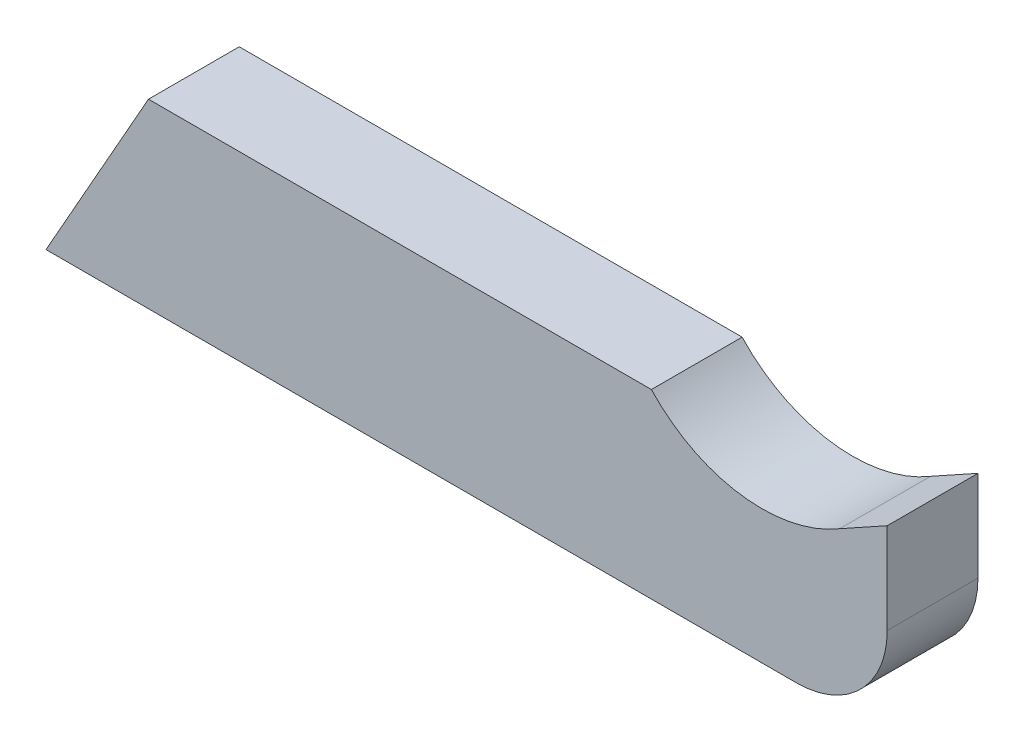
ISO-10303-21;
HEADER;
FILE_DESCRIPTION(('STEP AP214'),'2;1');
FILE_NAME('part.step','',(''),(''),'','','');
FILE_SCHEMA(('AUTOMOTIVE_DESIGN { 1 0 10303 214 1 1 1 1 }'));
ENDSEC;
DATA;
#1=APPLICATION_CONTEXT('core data for automotive mechanical design processes');
#2=APPLICATION_PROTOCOL_DEFINITION('international standard','automotive_design',2000,#1);
#3=PRODUCT_CONTEXT('',#1,'mechanical');
#4=PRODUCT('Part','Part','',(#3));
#5=PRODUCT_RELATED_PRODUCT_CATEGORY('part','',(#4));
#6=PRODUCT_DEFINITION_FORMATION('','',#4);
#7=PRODUCT_DEFINITION_CONTEXT('part definition',#1,'design');
#8=PRODUCT_DEFINITION('design','',#6,#7);
#9=PRODUCT_DEFINITION_SHAPE('','',#8);
#10=(LENGTH_UNIT() NAMED_UNIT(*) SI_UNIT(.MILLI.,.METRE.));
#11=(NAMED_UNIT(*) PLANE_ANGLE_UNIT() SI_UNIT($,.RADIAN.));
#12=(NAMED_UNIT(*) SI_UNIT($,.STERADIAN.) SOLID_ANGLE_UNIT());
#13=UNCERTAINTY_MEASURE_WITH_UNIT(LENGTH_MEASURE(1.E-05),#10,'distance_accuracy_value','');
#14=(GEOMETRIC_REPRESENTATION_CONTEXT(3) GLOBAL_UNCERTAINTY_ASSIGNED_CONTEXT((#13)) GLOBAL_UNIT_ASSIGNED_CONTEXT((#10,
#11,#12)) REPRESENTATION_CONTEXT('',''));
#15=CARTESIAN_POINT('',(0.,0.,0.));
#16=DIRECTION('',(0.,0.,1.));
#17=DIRECTION('',(1.,0.,0.));
#18=AXIS2_PLACEMENT_3D('',#15,#16,#17);
#19=CARTESIAN_POINT('',(-10.8675360202004,3.87705839752758,3.));
#20=DIRECTION('',(0.870805703548891,-0.491627324979726,0.));
#21=DIRECTION('',(0.491627324979726,0.870805703548891,0.));
#22=AXIS2_PLACEMENT_3D('',#19,#20,#21);
#23=PLANE('',#22);
#24=DIRECTION('',(-0.491627324979726,-0.870805703548891,0.));
#25=VECTOR('',#24,1.);
#26=CARTESIAN_POINT('',(-10.8675360202004,3.87705839752758,0.));
#27=LINE('',#26,#25);
#28=CARTESIAN_POINT('',(-10.8675360202004,3.87705839752758,0.));
#29=VERTEX_POINT('',#28);
#30=CARTESIAN_POINT('',(-14.254932241719,-2.12294160247242,0.));
#31=VERTEX_POINT('',#30);
#32=EDGE_CURVE('E129',#29,#31,#27,.T.);
#33=ORIENTED_EDGE('',*,*,#32,.T.);
#34=DIRECTION('',(0.,0.,-1.));
#35=VECTOR('',#34,1.);
#36=CARTESIAN_POINT('',(-14.254932241719,-2.12294160247242,3.));
#37=LINE('',#36,#35);
#38=CARTESIAN_POINT('',(-14.254932241719,-2.12294160247242,3.));
#39=VERTEX_POINT('',#38);
#40=EDGE_CURVE('E11',#39,#31,#37,.T.);
#41=ORIENTED_EDGE('',*,*,#40,.F.);
#42=DIRECTION('',(-0.491627324979726,-0.870805703548891,0.));
#43=VECTOR('',#42,1.);
#44=CARTESIAN_POINT('',(-10.8675360202004,3.87705839752758,3.));
#45=LINE('',#44,#43);
#46=CARTESIAN_POINT('',(-10.8675360202004,3.87705839752758,3.));
#47=VERTEX_POINT('',#46);
#48=EDGE_CURVE('E141',#47,#39,#45,.T.);
#49=ORIENTED_EDGE('',*,*,#48,.F.);
#50=DIRECTION('',(0.,0.,-1.));
#51=VECTOR('',#50,1.);
#52=CARTESIAN_POINT('',(-10.8675360202004,3.87705839752758,3.));
#53=LINE('',#52,#51);
#54=EDGE_CURVE('E124',#47,#29,#53,.T.);
#55=ORIENTED_EDGE('',*,*,#54,.T.);
#56=EDGE_LOOP('',(#33,#41,#49,#55));
#57=FACE_BOUND('',#56,.T.);
#58=ADVANCED_FACE('F39',(#57),#23,.F.);
#59=CARTESIAN_POINT('',(-14.254932241719,-2.12294160247242,3.));
#60=DIRECTION('',(0.,1.,0.));
#61=DIRECTION('',(0.,0.,1.));
#62=AXIS2_PLACEMENT_3D('',#59,#60,#61);
#63=PLANE('',#62);
#64=DIRECTION('',(1.,0.,0.));
#65=VECTOR('',#64,1.);
#66=CARTESIAN_POINT('',(-14.254932241719,-2.12294160247242,0.));
#67=LINE('',#66,#65);
#68=CARTESIAN_POINT('',(10.5532855236969,-2.12294160247242,0.));
#69=VERTEX_POINT('',#68);
#70=EDGE_CURVE('E135',#31,#69,#67,.T.);
#71=ORIENTED_EDGE('',*,*,#70,.T.);
#72=DIRECTION('',(0.,0.,-1.));
#73=VECTOR('',#72,1.);
#74=CARTESIAN_POINT('',(10.5532855236969,-2.12294160247242,3.));
#75=LINE('',#74,#73);
#76=CARTESIAN_POINT('',(10.5532855236969,-2.12294160247242,3.));
#77=VERTEX_POINT('',#76);
#78=EDGE_CURVE('E50',#77,#69,#75,.T.);
#79=ORIENTED_EDGE('',*,*,#78,.F.);
#80=DIRECTION('',(1.,0.,0.));
#81=VECTOR('',#80,1.);
#82=CARTESIAN_POINT('',(-14.254932241719,-2.12294160247242,3.));
#83=LINE('',#82,#81);
#84=EDGE_CURVE('E94',#39,#77,#83,.T.);
#85=ORIENTED_EDGE('',*,*,#84,.F.);
#86=ORIENTED_EDGE('',*,*,#40,.T.);
#87=EDGE_LOOP('',(#71,#79,#85,#86));
#88=FACE_BOUND('',#87,.T.);
#89=ADVANCED_FACE('F168',(#88),#63,.F.);
#90=CARTESIAN_POINT('',(10.5532855236969,0.877058397527587,3.));
#91=DIRECTION('',(0.,0.,-1.));
#92=DIRECTION('',(-1.,0.,0.));
#93=AXIS2_PLACEMENT_3D('',#90,#91,#92);
#94=CYLINDRICAL_SURFACE('',#93,2.99999999999999);
#95=CARTESIAN_POINT('',(10.5532855236969,0.877058397527587,0.));
#96=DIRECTION('',(0.,0.,1.));
#97=DIRECTION('',(1.,0.,0.));
#98=AXIS2_PLACEMENT_3D('',#95,#96,#97);
#99=CIRCLE('',#98,2.99999999999999);
#100=CARTESIAN_POINT('',(13.5532855236969,0.877058397527587,0.));
#101=VERTEX_POINT('',#100);
#102=EDGE_CURVE('E132',#69,#101,#99,.T.);
#103=ORIENTED_EDGE('',*,*,#102,.T.);
#104=DIRECTION('',(0.,0.,-1.));
#105=VECTOR('',#104,1.);
#106=CARTESIAN_POINT('',(13.5532855236969,0.877058397527587,3.));
#107=LINE('',#106,#105);
#108=CARTESIAN_POINT('',(13.5532855236969,0.877058397527587,3.));
#109=VERTEX_POINT('',#108);
#110=EDGE_CURVE('E144',#109,#101,#107,.T.);
#111=ORIENTED_EDGE('',*,*,#110,.F.);
#112=CARTESIAN_POINT('',(10.5532855236969,0.877058397527587,3.));
#113=DIRECTION('',(0.,0.,1.));
#114=DIRECTION('',(1.,0.,0.));
#115=AXIS2_PLACEMENT_3D('',#112,#113,#114);
#116=CIRCLE('',#115,2.99999999999999);
#117=EDGE_CURVE('E153',#77,#109,#116,.T.);
#118=ORIENTED_EDGE('',*,*,#117,.F.);
#119=ORIENTED_EDGE('',*,*,#78,.T.);
#120=EDGE_LOOP('',(#103,#111,#118,#119));
#121=FACE_BOUND('',#120,.T.);
#122=ADVANCED_FACE('F152',(#121),#94,.T.);
#123=CARTESIAN_POINT('',(13.5532855236969,0.877058397527587,3.));
#124=DIRECTION('',(-1.,0.,0.));
#125=DIRECTION('',(0.,0.,1.));
#126=AXIS2_PLACEMENT_3D('',#123,#124,#125);
#127=PLANE('',#126);
#128=DIRECTION('',(0.,1.,0.));
#129=VECTOR('',#128,1.);
#130=CARTESIAN_POINT('',(13.5532855236969,0.877058397527587,0.));
#131=LINE('',#130,#129);
#132=CARTESIAN_POINT('',(13.5532855236969,3.87705839752757,0.));
#133=VERTEX_POINT('',#132);
#134=EDGE_CURVE('E136',#101,#133,#131,.T.);
#135=ORIENTED_EDGE('',*,*,#134,.T.);
#136=DIRECTION('',(0.,0.,-1.));
#137=VECTOR('',#136,1.);
#138=CARTESIAN_POINT('',(13.5532855236969,3.87705839752757,3.));
#139=LINE('',#138,#137);
#140=CARTESIAN_POINT('',(13.5532855236969,3.87705839752757,3.));
#141=VERTEX_POINT('',#140);
#142=EDGE_CURVE('E116',#141,#133,#139,.T.);
#143=ORIENTED_EDGE('',*,*,#142,.F.);
#144=DIRECTION('',(0.,1.,0.));
#145=VECTOR('',#144,1.);
#146=CARTESIAN_POINT('',(13.5532855236969,0.877058397527587,3.));
#147=LINE('',#146,#145);
#148=EDGE_CURVE('E112',#109,#141,#147,.T.);
#149=ORIENTED_EDGE('',*,*,#148,.F.);
#150=ORIENTED_EDGE('',*,*,#110,.T.);
#151=EDGE_LOOP('',(#135,#143,#149,#150));
#152=FACE_BOUND('',#151,.T.);
#153=ADVANCED_FACE('F159',(#152),#127,.F.);
#154=CARTESIAN_POINT('',(13.5532855236969,3.87705839752757,3.));
#155=DIRECTION('',(0.485119556305623,-0.874447834973497,0.));
#156=DIRECTION('',(0.874447834973497,0.485119556305623,0.));
#157=AXIS2_PLACEMENT_3D('',#154,#155,#156);
#158=PLANE('',#157);
#159=DIRECTION('',(-0.874447834973497,-0.485119556305623,0.));
#160=VECTOR('',#159,1.);
#161=CARTESIAN_POINT('',(13.5532855236969,3.87705839752757,0.));
#162=LINE('',#161,#160);
#163=CARTESIAN_POINT('',(11.9839251052848,3.00642049391063,0.));
#164=VERTEX_POINT('',#163);
#165=EDGE_CURVE('E119',#133,#164,#162,.T.);
#166=ORIENTED_EDGE('',*,*,#165,.T.);
#167=DIRECTION('',(0.,0.,-1.));
#168=VECTOR('',#167,1.);
#169=CARTESIAN_POINT('',(11.9839251052848,3.00642049391063,3.));
#170=LINE('',#169,#168);
#171=CARTESIAN_POINT('',(11.9839251052848,3.00642049391063,3.));
#172=VERTEX_POINT('',#171);
#173=EDGE_CURVE('E117',#172,#164,#170,.T.);
#174=ORIENTED_EDGE('',*,*,#173,.F.);
#175=DIRECTION('',(-0.874447834973497,-0.485119556305623,0.));
#176=VECTOR('',#175,1.);
#177=CARTESIAN_POINT('',(13.5532855236969,3.87705839752757,3.));
#178=LINE('',#177,#176);
#179=EDGE_CURVE('E103',#141,#172,#178,.T.);
#180=ORIENTED_EDGE('',*,*,#179,.F.);
#181=ORIENTED_EDGE('',*,*,#142,.T.);
#182=EDGE_LOOP('',(#166,#174,#180,#181));
#183=FACE_BOUND('',#182,.T.);
#184=ADVANCED_FACE('F120',(#183),#158,.F.);
#185=CARTESIAN_POINT('',(9.40873473073451,7.29225699742118,3.));
#186=DIRECTION('',(0.,0.,-1.));
#187=DIRECTION('',(-1.,0.,0.));
#188=AXIS2_PLACEMENT_3D('',#185,#186,#187);
#189=CYLINDRICAL_SURFACE('',#188,5.);
#190=CARTESIAN_POINT('',(9.40873473073451,7.29225699742118,0.));
#191=DIRECTION('',(0.,0.,-1.));
#192=DIRECTION('',(1.,0.,0.));
#193=AXIS2_PLACEMENT_3D('',#190,#191,#192);
#194=CIRCLE('',#193,5.);
#195=CARTESIAN_POINT('',(5.75682858143594,3.87705839752757,0.));
#196=VERTEX_POINT('',#195);
#197=EDGE_CURVE('E83',#164,#196,#194,.T.);
#198=ORIENTED_EDGE('',*,*,#197,.T.);
#199=DIRECTION('',(0.,0.,-1.));
#200=VECTOR('',#199,1.);
#201=CARTESIAN_POINT('',(5.75682858143594,3.87705839752757,3.));
#202=LINE('',#201,#200);
#203=CARTESIAN_POINT('',(5.75682858143594,3.87705839752757,3.));
#204=VERTEX_POINT('',#203);
#205=EDGE_CURVE('E123',#204,#196,#202,.T.);
#206=ORIENTED_EDGE('',*,*,#205,.F.);
#207=CARTESIAN_POINT('',(9.40873473073451,7.29225699742118,3.));
#208=DIRECTION('',(0.,0.,-1.));
#209=DIRECTION('',(1.,0.,0.));
#210=AXIS2_PLACEMENT_3D('',#207,#208,#209);
#211=CIRCLE('',#210,5.);
#212=EDGE_CURVE('E109',#172,#204,#211,.T.);
#213=ORIENTED_EDGE('',*,*,#212,.F.);
#214=ORIENTED_EDGE('',*,*,#173,.T.);
#215=EDGE_LOOP('',(#198,#206,#213,#214));
#216=FACE_BOUND('',#215,.T.);
#217=ADVANCED_FACE('F121',(#216),#189,.F.);
#218=CARTESIAN_POINT('',(5.75682858143594,3.87705839752757,3.));
#219=DIRECTION('',(0.,-1.,0.));
#220=DIRECTION('',(1.,0.,0.));
#221=AXIS2_PLACEMENT_3D('',#218,#219,#220);
#222=PLANE('',#221);
#223=DIRECTION('',(-1.,0.,0.));
#224=VECTOR('',#223,1.);
#225=CARTESIAN_POINT('',(5.75682858143594,3.87705839752757,0.));
#226=LINE('',#225,#224);
#227=EDGE_CURVE('E90',#196,#29,#226,.T.);
#228=ORIENTED_EDGE('',*,*,#227,.T.);
#229=ORIENTED_EDGE('',*,*,#54,.F.);
#230=DIRECTION('',(-1.,0.,0.));
#231=VECTOR('',#230,1.);
#232=CARTESIAN_POINT('',(5.75682858143594,3.87705839752757,3.));
#233=LINE('',#232,#231);
#234=EDGE_CURVE('E54',#204,#47,#233,.T.);
#235=ORIENTED_EDGE('',*,*,#234,.F.);
#236=ORIENTED_EDGE('',*,*,#205,.T.);
#237=EDGE_LOOP('',(#228,#229,#235,#236));
#238=FACE_BOUND('',#237,.T.);
#239=ADVANCED_FACE('F179',(#238),#222,.F.);
#240=CARTESIAN_POINT('',(10.5532855236969,0.877058397527587,3.));
#241=DIRECTION('',(0.,0.,1.));
#242=DIRECTION('',(1.,0.,0.));
#243=AXIS2_PLACEMENT_3D('',#240,#241,#242);
#244=PLANE('',#243);
#245=ORIENTED_EDGE('',*,*,#48,.T.);
#246=ORIENTED_EDGE('',*,*,#84,.T.);
#247=ORIENTED_EDGE('',*,*,#117,.T.);
#248=ORIENTED_EDGE('',*,*,#148,.T.);
#249=ORIENTED_EDGE('',*,*,#179,.T.);
#250=ORIENTED_EDGE('',*,*,#212,.T.);
#251=ORIENTED_EDGE('',*,*,#234,.T.);
#252=EDGE_LOOP('',(#245,#246,#247,#248,#249,#250,#251));
#253=FACE_BOUND('',#252,.T.);
#254=ADVANCED_FACE('F110',(#253),#244,.T.);
#255=CARTESIAN_POINT('',(10.5532855236969,0.877058397527587,0.));
#256=DIRECTION('',(0.,0.,1.));
#257=DIRECTION('',(1.,0.,0.));
#258=AXIS2_PLACEMENT_3D('',#255,#256,#257);
#259=PLANE('',#258);
#260=ORIENTED_EDGE('',*,*,#32,.F.);
#261=ORIENTED_EDGE('',*,*,#227,.F.);
#262=ORIENTED_EDGE('',*,*,#197,.F.);
#263=ORIENTED_EDGE('',*,*,#165,.F.);
#264=ORIENTED_EDGE('',*,*,#134,.F.);
#265=ORIENTED_EDGE('',*,*,#102,.F.);
#266=ORIENTED_EDGE('',*,*,#70,.F.);
#267=EDGE_LOOP('',(#260,#261,#262,#263,#264,#265,#266));
#268=FACE_BOUND('',#267,.T.);
#269=ADVANCED_FACE('F160',(#268),#259,.F.);
#270=CLOSED_SHELL('',(#58,#89,#122,#153,#184,#217,#239,#254,#269));
#271=MANIFOLD_SOLID_BREP('B2',#270);
#272=ADVANCED_BREP_SHAPE_REPRESENTATION('',(#18,#271),#14);
#273=SHAPE_DEFINITION_REPRESENTATION(#9,#272);
ENDSEC;
END-ISO-10303-21;
